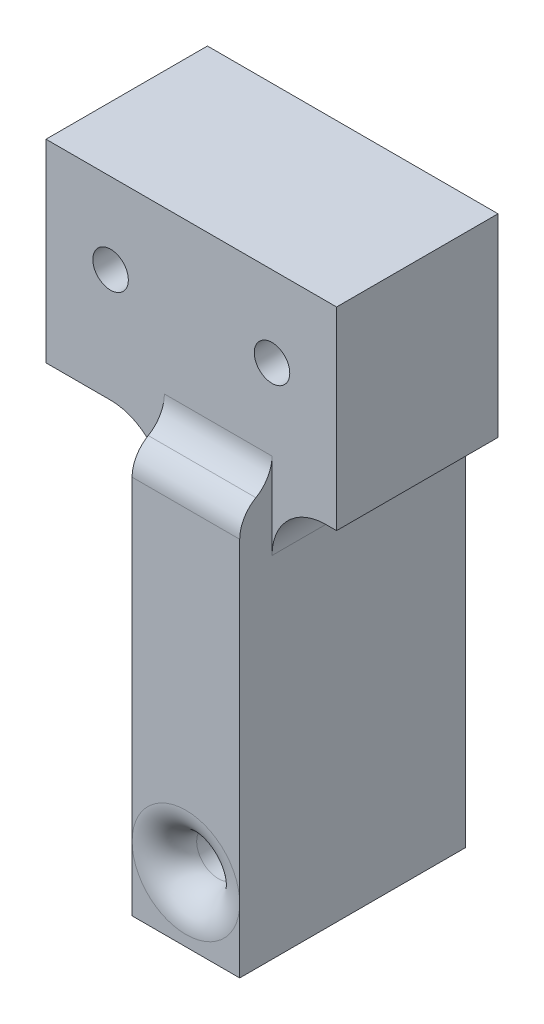
ISO-10303-21;
HEADER;
FILE_DESCRIPTION(('STEP AP214'),'2;1');
FILE_NAME('part.step','',(''),(''),'','','');
FILE_SCHEMA(('AUTOMOTIVE_DESIGN { 1 0 10303 214 1 1 1 1 }'));
ENDSEC;
DATA;
#1=APPLICATION_CONTEXT('core data for automotive mechanical design processes');
#2=APPLICATION_PROTOCOL_DEFINITION('international standard','automotive_design',2000,#1);
#3=PRODUCT_CONTEXT('',#1,'mechanical');
#4=PRODUCT('Part','Part','',(#3));
#5=PRODUCT_RELATED_PRODUCT_CATEGORY('part','',(#4));
#6=PRODUCT_DEFINITION_FORMATION('','',#4);
#7=PRODUCT_DEFINITION_CONTEXT('part definition',#1,'design');
#8=PRODUCT_DEFINITION('design','',#6,#7);
#9=PRODUCT_DEFINITION_SHAPE('','',#8);
#10=(LENGTH_UNIT() NAMED_UNIT(*) SI_UNIT(.MILLI.,.METRE.));
#11=(NAMED_UNIT(*) PLANE_ANGLE_UNIT() SI_UNIT($,.RADIAN.));
#12=(NAMED_UNIT(*) SI_UNIT($,.STERADIAN.) SOLID_ANGLE_UNIT());
#13=UNCERTAINTY_MEASURE_WITH_UNIT(LENGTH_MEASURE(1.E-05),#10,'distance_accuracy_value','');
#14=(GEOMETRIC_REPRESENTATION_CONTEXT(3) GLOBAL_UNCERTAINTY_ASSIGNED_CONTEXT((#13)) GLOBAL_UNIT_ASSIGNED_CONTEXT((#10,
#11,#12)) REPRESENTATION_CONTEXT('',''));
#15=CARTESIAN_POINT('',(0.,0.,0.));
#16=DIRECTION('',(0.,0.,1.));
#17=DIRECTION('',(1.,0.,0.));
#18=AXIS2_PLACEMENT_3D('',#15,#16,#17);
#19=CARTESIAN_POINT('',(-2.5,-48.,18.));
#20=DIRECTION('',(0.,0.,-1.));
#21=DIRECTION('',(-1.,0.,0.));
#22=AXIS2_PLACEMENT_3D('',#19,#20,#21);
#23=PLANE('',#22);
#24=DIRECTION('',(0.,1.,0.));
#25=VECTOR('',#24,1.);
#26=CARTESIAN_POINT('',(7.5,-48.,18.));
#27=LINE('',#26,#25);
#28=CARTESIAN_POINT('',(7.5,-42.,18.));
#29=VERTEX_POINT('',#28);
#30=CARTESIAN_POINT('',(7.5,-12.6961524227066,18.));
#31=VERTEX_POINT('',#30);
#32=EDGE_CURVE('E365',#29,#31,#27,.T.);
#33=ORIENTED_EDGE('',*,*,#32,.T.);
#34=DIRECTION('',(-1.,0.,0.));
#35=VECTOR('',#34,1.);
#36=CARTESIAN_POINT('',(-2.5,-12.6961524227066,18.));
#37=LINE('',#36,#35);
#38=CARTESIAN_POINT('',(-2.5,-12.6961524227066,18.));
#39=VERTEX_POINT('',#38);
#40=EDGE_CURVE('E296',#31,#39,#37,.T.);
#41=ORIENTED_EDGE('',*,*,#40,.T.);
#42=DIRECTION('',(0.,1.,0.));
#43=VECTOR('',#42,1.);
#44=CARTESIAN_POINT('',(-2.5,-48.,18.));
#45=LINE('',#44,#43);
#46=CARTESIAN_POINT('',(-2.5,-42.,18.));
#47=VERTEX_POINT('',#46);
#48=EDGE_CURVE('E368',#47,#39,#45,.T.);
#49=ORIENTED_EDGE('',*,*,#48,.F.);
#50=CARTESIAN_POINT('',(2.5,-42.,18.));
#51=DIRECTION('',(0.,0.,-1.));
#52=DIRECTION('',(-1.,0.,0.));
#53=AXIS2_PLACEMENT_3D('',#50,#51,#52);
#54=CIRCLE('',#53,5.);
#55=EDGE_CURVE('E254',#47,#29,#54,.T.);
#56=ORIENTED_EDGE('',*,*,#55,.T.);
#57=EDGE_LOOP('',(#33,#41,#49,#56));
#58=FACE_BOUND('',#57,.T.);
#59=ADVANCED_FACE('F41',(#58),#23,.F.);
#60=CARTESIAN_POINT('',(-2.5,-48.,-3.));
#61=DIRECTION('',(0.,0.,1.));
#62=DIRECTION('',(1.,0.,0.));
#63=AXIS2_PLACEMENT_3D('',#60,#61,#62);
#64=PLANE('',#63);
#65=DIRECTION('',(0.,1.,0.));
#66=VECTOR('',#65,1.);
#67=CARTESIAN_POINT('',(-2.5,-48.,-3.));
#68=LINE('',#67,#66);
#69=CARTESIAN_POINT('',(-2.5,-48.,-3.));
#70=VERTEX_POINT('',#69);
#71=CARTESIAN_POINT('',(-2.5,-42.,-3.));
#72=VERTEX_POINT('',#71);
#73=EDGE_CURVE('E172',#70,#72,#68,.T.);
#74=ORIENTED_EDGE('',*,*,#73,.T.);
#75=CARTESIAN_POINT('',(2.5,-42.,-3.));
#76=DIRECTION('',(0.,0.,1.));
#77=DIRECTION('',(1.,0.,0.));
#78=AXIS2_PLACEMENT_3D('',#75,#76,#77);
#79=CIRCLE('',#78,5.);
#80=CARTESIAN_POINT('',(7.5,-42.,-3.));
#81=VERTEX_POINT('',#80);
#82=EDGE_CURVE('E250',#72,#81,#79,.T.);
#83=ORIENTED_EDGE('',*,*,#82,.T.);
#84=DIRECTION('',(0.,1.,0.));
#85=VECTOR('',#84,1.);
#86=CARTESIAN_POINT('',(7.5,-48.,-3.));
#87=LINE('',#86,#85);
#88=CARTESIAN_POINT('',(7.5,-48.,-3.));
#89=VERTEX_POINT('',#88);
#90=EDGE_CURVE('E175',#89,#81,#87,.T.);
#91=ORIENTED_EDGE('',*,*,#90,.F.);
#92=DIRECTION('',(1.,0.,0.));
#93=VECTOR('',#92,1.);
#94=CARTESIAN_POINT('',(-2.5,-48.,-3.));
#95=LINE('',#94,#93);
#96=EDGE_CURVE('E167',#70,#89,#95,.T.);
#97=ORIENTED_EDGE('',*,*,#96,.F.);
#98=EDGE_LOOP('',(#74,#83,#91,#97));
#99=FACE_BOUND('',#98,.T.);
#100=ADVANCED_FACE('F169',(#99),#64,.F.);
#101=CARTESIAN_POINT('',(-13.5,-10.5,15.));
#102=DIRECTION('',(0.,1.,0.));
#103=DIRECTION('',(0.,0.,1.));
#104=AXIS2_PLACEMENT_3D('',#101,#102,#103);
#105=PLANE('',#104);
#106=DIRECTION('',(1.,0.,0.));
#107=VECTOR('',#106,1.);
#108=CARTESIAN_POINT('',(-13.5,-10.5,0.));
#109=LINE('',#108,#107);
#110=CARTESIAN_POINT('',(-13.5,-10.5,0.));
#111=VERTEX_POINT('',#110);
#112=CARTESIAN_POINT('',(-7.5,-10.5,0.));
#113=VERTEX_POINT('',#112);
#114=EDGE_CURVE('E228',#111,#113,#109,.T.);
#115=ORIENTED_EDGE('',*,*,#114,.T.);
#116=DIRECTION('',(0.,0.,-1.));
#117=VECTOR('',#116,1.);
#118=CARTESIAN_POINT('',(-7.5,-10.5,15.));
#119=LINE('',#118,#117);
#120=CARTESIAN_POINT('',(-7.5,-10.5,15.));
#121=VERTEX_POINT('',#120);
#122=EDGE_CURVE('E62',#113,#121,#119,.F.);
#123=ORIENTED_EDGE('',*,*,#122,.T.);
#124=DIRECTION('',(1.,0.,0.));
#125=VECTOR('',#124,1.);
#126=CARTESIAN_POINT('',(-13.5,-10.5,15.));
#127=LINE('',#126,#125);
#128=CARTESIAN_POINT('',(-13.5,-10.5,15.));
#129=VERTEX_POINT('',#128);
#130=EDGE_CURVE('E220',#129,#121,#127,.T.);
#131=ORIENTED_EDGE('',*,*,#130,.F.);
#132=DIRECTION('',(0.,0.,-1.));
#133=VECTOR('',#132,1.);
#134=CARTESIAN_POINT('',(-13.5,-10.5,15.));
#135=LINE('',#134,#133);
#136=EDGE_CURVE('E233',#129,#111,#135,.T.);
#137=ORIENTED_EDGE('',*,*,#136,.T.);
#138=EDGE_LOOP('',(#115,#123,#131,#137));
#139=FACE_BOUND('',#138,.T.);
#140=ADVANCED_FACE('F398',(#139),#105,.F.);
#141=CARTESIAN_POINT('',(12.5,-10.5,15.));
#142=VERTEX_POINT('',#141);
#143=CARTESIAN_POINT('',(13.5,-10.5,15.));
#144=VERTEX_POINT('',#143);
#145=EDGE_CURVE('E219',#142,#144,#127,.T.);
#146=ORIENTED_EDGE('',*,*,#145,.F.);
#147=DIRECTION('',(0.,0.,1.));
#148=VECTOR('',#147,1.);
#149=CARTESIAN_POINT('',(12.5,-10.5,0.));
#150=LINE('',#149,#148);
#151=CARTESIAN_POINT('',(12.5,-10.5,0.));
#152=VERTEX_POINT('',#151);
#153=EDGE_CURVE('E304',#142,#152,#150,.F.);
#154=ORIENTED_EDGE('',*,*,#153,.T.);
#155=CARTESIAN_POINT('',(13.5,-10.5,0.));
#156=VERTEX_POINT('',#155);
#157=EDGE_CURVE('E227',#152,#156,#109,.T.);
#158=ORIENTED_EDGE('',*,*,#157,.T.);
#159=DIRECTION('',(0.,0.,-1.));
#160=VECTOR('',#159,1.);
#161=CARTESIAN_POINT('',(13.5,-10.5,15.));
#162=LINE('',#161,#160);
#163=EDGE_CURVE('E222',#144,#156,#162,.T.);
#164=ORIENTED_EDGE('',*,*,#163,.F.);
#165=EDGE_LOOP('',(#146,#154,#158,#164));
#166=FACE_BOUND('',#165,.T.);
#167=ADVANCED_FACE('F424',(#166),#105,.F.);
#168=CARTESIAN_POINT('',(0.,0.,15.));
#169=DIRECTION('',(0.,0.,-1.));
#170=DIRECTION('',(-1.,0.,0.));
#171=AXIS2_PLACEMENT_3D('',#168,#169,#170);
#172=PLANE('',#171);
#173=DIRECTION('',(1.,0.,0.));
#174=VECTOR('',#173,1.);
#175=CARTESIAN_POINT('',(7.5,-7.5,15.));
#176=LINE('',#175,#174);
#177=CARTESIAN_POINT('',(-2.5,-7.5,15.));
#178=VERTEX_POINT('',#177);
#179=CARTESIAN_POINT('',(7.5,-7.5,15.));
#180=VERTEX_POINT('',#179);
#181=EDGE_CURVE('E268',#178,#180,#176,.T.);
#182=ORIENTED_EDGE('',*,*,#181,.T.);
#183=DIRECTION('',(0.,-1.,0.));
#184=VECTOR('',#183,1.);
#185=CARTESIAN_POINT('',(7.5,-48.,15.));
#186=LINE('',#185,#184);
#187=CARTESIAN_POINT('',(7.5,-15.5,15.));
#188=VERTEX_POINT('',#187);
#189=EDGE_CURVE('E271',#180,#188,#186,.T.);
#190=ORIENTED_EDGE('',*,*,#189,.T.);
#191=CARTESIAN_POINT('',(12.5,-15.5,15.));
#192=DIRECTION('',(0.,0.,-1.));
#193=DIRECTION('',(-1.,0.,0.));
#194=AXIS2_PLACEMENT_3D('',#191,#192,#193);
#195=CIRCLE('',#194,5.);
#196=EDGE_CURVE('E309',#188,#142,#195,.T.);
#197=ORIENTED_EDGE('',*,*,#196,.T.);
#198=ORIENTED_EDGE('',*,*,#145,.T.);
#199=DIRECTION('',(0.,1.,0.));
#200=VECTOR('',#199,1.);
#201=CARTESIAN_POINT('',(13.5,-7.5,15.));
#202=LINE('',#201,#200);
#203=CARTESIAN_POINT('',(13.5,7.5,15.));
#204=VERTEX_POINT('',#203);
#205=EDGE_CURVE('E211',#144,#204,#202,.T.);
#206=ORIENTED_EDGE('',*,*,#205,.T.);
#207=DIRECTION('',(-1.,0.,0.));
#208=VECTOR('',#207,1.);
#209=CARTESIAN_POINT('',(-13.5,7.5,15.));
#210=LINE('',#209,#208);
#211=CARTESIAN_POINT('',(-13.5,7.5,15.));
#212=VERTEX_POINT('',#211);
#213=EDGE_CURVE('E214',#204,#212,#210,.T.);
#214=ORIENTED_EDGE('',*,*,#213,.T.);
#215=DIRECTION('',(0.,-1.,0.));
#216=VECTOR('',#215,1.);
#217=CARTESIAN_POINT('',(-13.5,-7.5,15.));
#218=LINE('',#217,#216);
#219=EDGE_CURVE('E217',#212,#129,#218,.T.);
#220=ORIENTED_EDGE('',*,*,#219,.T.);
#221=ORIENTED_EDGE('',*,*,#130,.T.);
#222=CARTESIAN_POINT('',(-7.5,-15.5,15.));
#223=DIRECTION('',(0.,0.,-1.));
#224=DIRECTION('',(-1.,0.,0.));
#225=AXIS2_PLACEMENT_3D('',#222,#223,#224);
#226=CIRCLE('',#225,5.);
#227=CARTESIAN_POINT('',(-2.5,-15.5,15.));
#228=VERTEX_POINT('',#227);
#229=EDGE_CURVE('E11',#121,#228,#226,.T.);
#230=ORIENTED_EDGE('',*,*,#229,.T.);
#231=DIRECTION('',(0.,1.,0.));
#232=VECTOR('',#231,1.);
#233=CARTESIAN_POINT('',(-2.5,-48.,15.));
#234=LINE('',#233,#232);
#235=EDGE_CURVE('E265',#228,#178,#234,.T.);
#236=ORIENTED_EDGE('',*,*,#235,.T.);
#237=EDGE_LOOP('',(#182,#190,#197,#198,#206,#214,#220,#221,#230,#236));
#238=FACE_BOUND('',#237,.T.);
#239=CARTESIAN_POINT('',(7.5,0.,15.));
#240=DIRECTION('',(0.,0.,1.));
#241=DIRECTION('',(1.,0.,0.));
#242=AXIS2_PLACEMENT_3D('',#239,#240,#241);
#243=CIRCLE('',#242,1.65);
#244=CARTESIAN_POINT('',(9.15,0.,15.));
#245=VERTEX_POINT('',#244);
#246=EDGE_CURVE('E205',#245,#245,#243,.T.);
#247=ORIENTED_EDGE('',*,*,#246,.F.);
#248=EDGE_LOOP('',(#247));
#249=FACE_BOUND('',#248,.T.);
#250=CARTESIAN_POINT('',(-7.5,0.,15.));
#251=DIRECTION('',(0.,0.,1.));
#252=DIRECTION('',(1.,0.,0.));
#253=AXIS2_PLACEMENT_3D('',#250,#251,#252);
#254=CIRCLE('',#253,1.65);
#255=CARTESIAN_POINT('',(-5.85,0.,15.));
#256=VERTEX_POINT('',#255);
#257=EDGE_CURVE('E197',#256,#256,#254,.T.);
#258=ORIENTED_EDGE('',*,*,#257,.F.);
#259=EDGE_LOOP('',(#258));
#260=FACE_BOUND('',#259,.T.);
#261=ADVANCED_FACE('F421',(#238,#249,#260),#172,.F.);
#262=CARTESIAN_POINT('',(0.,0.,0.));
#263=DIRECTION('',(0.,0.,-1.));
#264=DIRECTION('',(-1.,0.,0.));
#265=AXIS2_PLACEMENT_3D('',#262,#263,#264);
#266=PLANE('',#265);
#267=CARTESIAN_POINT('',(7.5,0.,0.));
#268=DIRECTION('',(0.,0.,1.));
#269=DIRECTION('',(1.,0.,0.));
#270=AXIS2_PLACEMENT_3D('',#267,#268,#269);
#271=CIRCLE('',#270,1.65);
#272=CARTESIAN_POINT('',(9.15,0.,0.));
#273=VERTEX_POINT('',#272);
#274=EDGE_CURVE('E203',#273,#273,#271,.T.);
#275=ORIENTED_EDGE('',*,*,#274,.T.);
#276=EDGE_LOOP('',(#275));
#277=FACE_BOUND('',#276,.T.);
#278=ORIENTED_EDGE('',*,*,#157,.F.);
#279=CARTESIAN_POINT('',(12.5,-15.5,0.));
#280=DIRECTION('',(0.,0.,-1.));
#281=DIRECTION('',(-1.,0.,0.));
#282=AXIS2_PLACEMENT_3D('',#279,#280,#281);
#283=CIRCLE('',#282,5.);
#284=CARTESIAN_POINT('',(7.5,-15.5,0.));
#285=VERTEX_POINT('',#284);
#286=EDGE_CURVE('E311',#152,#285,#283,.F.);
#287=ORIENTED_EDGE('',*,*,#286,.T.);
#288=DIRECTION('',(0.,1.,0.));
#289=VECTOR('',#288,1.);
#290=CARTESIAN_POINT('',(7.5,0.,0.));
#291=LINE('',#290,#289);
#292=CARTESIAN_POINT('',(7.5,-7.5,0.));
#293=VERTEX_POINT('',#292);
#294=EDGE_CURVE('E262',#285,#293,#291,.T.);
#295=ORIENTED_EDGE('',*,*,#294,.T.);
#296=DIRECTION('',(1.,0.,0.));
#297=VECTOR('',#296,1.);
#298=CARTESIAN_POINT('',(0.,-7.5,0.));
#299=LINE('',#298,#297);
#300=CARTESIAN_POINT('',(-2.5,-7.5,0.));
#301=VERTEX_POINT('',#300);
#302=EDGE_CURVE('E259',#293,#301,#299,.F.);
#303=ORIENTED_EDGE('',*,*,#302,.T.);
#304=DIRECTION('',(0.,-1.,0.));
#305=VECTOR('',#304,1.);
#306=CARTESIAN_POINT('',(-2.5,0.,0.));
#307=LINE('',#306,#305);
#308=CARTESIAN_POINT('',(-2.5,-15.5,0.));
#309=VERTEX_POINT('',#308);
#310=EDGE_CURVE('E257',#301,#309,#307,.T.);
#311=ORIENTED_EDGE('',*,*,#310,.T.);
#312=CARTESIAN_POINT('',(-7.5,-15.5,0.));
#313=DIRECTION('',(0.,0.,-1.));
#314=DIRECTION('',(-1.,0.,0.));
#315=AXIS2_PLACEMENT_3D('',#312,#313,#314);
#316=CIRCLE('',#315,5.);
#317=EDGE_CURVE('E49',#309,#113,#316,.F.);
#318=ORIENTED_EDGE('',*,*,#317,.T.);
#319=ORIENTED_EDGE('',*,*,#114,.F.);
#320=DIRECTION('',(0.,-1.,0.));
#321=VECTOR('',#320,1.);
#322=CARTESIAN_POINT('',(-13.5,-7.5,0.));
#323=LINE('',#322,#321);
#324=CARTESIAN_POINT('',(-13.5,7.5,0.));
#325=VERTEX_POINT('',#324);
#326=EDGE_CURVE('E225',#325,#111,#323,.T.);
#327=ORIENTED_EDGE('',*,*,#326,.F.);
#328=DIRECTION('',(-1.,0.,0.));
#329=VECTOR('',#328,1.);
#330=CARTESIAN_POINT('',(-13.5,7.5,0.));
#331=LINE('',#330,#329);
#332=CARTESIAN_POINT('',(13.5,7.5,0.));
#333=VERTEX_POINT('',#332);
#334=EDGE_CURVE('E208',#333,#325,#331,.T.);
#335=ORIENTED_EDGE('',*,*,#334,.F.);
#336=DIRECTION('',(0.,1.,0.));
#337=VECTOR('',#336,1.);
#338=CARTESIAN_POINT('',(13.5,-10.5,0.));
#339=LINE('',#338,#337);
#340=EDGE_CURVE('E215',#156,#333,#339,.T.);
#341=ORIENTED_EDGE('',*,*,#340,.F.);
#342=EDGE_LOOP('',(#278,#287,#295,#303,#311,#318,#319,#327,#335,#341));
#343=FACE_BOUND('',#342,.T.);
#344=CARTESIAN_POINT('',(-7.5,0.,0.));
#345=DIRECTION('',(0.,0.,1.));
#346=DIRECTION('',(1.,0.,0.));
#347=AXIS2_PLACEMENT_3D('',#344,#345,#346);
#348=CIRCLE('',#347,1.65);
#349=CARTESIAN_POINT('',(-5.85,0.,0.));
#350=VERTEX_POINT('',#349);
#351=EDGE_CURVE('E194',#350,#350,#348,.T.);
#352=ORIENTED_EDGE('',*,*,#351,.T.);
#353=EDGE_LOOP('',(#352));
#354=FACE_BOUND('',#353,.T.);
#355=ADVANCED_FACE('F316',(#277,#343,#354),#266,.T.);
#356=CARTESIAN_POINT('',(-13.5,7.5,15.));
#357=DIRECTION('',(0.,-1.,0.));
#358=DIRECTION('',(0.,0.,-1.));
#359=AXIS2_PLACEMENT_3D('',#356,#357,#358);
#360=PLANE('',#359);
#361=ORIENTED_EDGE('',*,*,#334,.T.);
#362=DIRECTION('',(0.,0.,-1.));
#363=VECTOR('',#362,1.);
#364=CARTESIAN_POINT('',(-13.5,7.5,15.));
#365=LINE('',#364,#363);
#366=EDGE_CURVE('E236',#212,#325,#365,.T.);
#367=ORIENTED_EDGE('',*,*,#366,.F.);
#368=ORIENTED_EDGE('',*,*,#213,.F.);
#369=DIRECTION('',(0.,0.,-1.));
#370=VECTOR('',#369,1.);
#371=CARTESIAN_POINT('',(13.5,7.5,15.));
#372=LINE('',#371,#370);
#373=EDGE_CURVE('E239',#204,#333,#372,.T.);
#374=ORIENTED_EDGE('',*,*,#373,.T.);
#375=EDGE_LOOP('',(#361,#367,#368,#374));
#376=FACE_BOUND('',#375,.T.);
#377=ADVANCED_FACE('F428',(#376),#360,.F.);
#378=CARTESIAN_POINT('',(-13.5,-7.5,15.));
#379=DIRECTION('',(1.,0.,0.));
#380=DIRECTION('',(0.,1.,0.));
#381=AXIS2_PLACEMENT_3D('',#378,#379,#380);
#382=PLANE('',#381);
#383=ORIENTED_EDGE('',*,*,#326,.T.);
#384=ORIENTED_EDGE('',*,*,#136,.F.);
#385=ORIENTED_EDGE('',*,*,#219,.F.);
#386=ORIENTED_EDGE('',*,*,#366,.T.);
#387=EDGE_LOOP('',(#383,#384,#385,#386));
#388=FACE_BOUND('',#387,.T.);
#389=ADVANCED_FACE('F432',(#388),#382,.F.);
#390=CARTESIAN_POINT('',(13.5,-10.5,15.));
#391=DIRECTION('',(-1.,0.,0.));
#392=DIRECTION('',(0.,-1.,0.));
#393=AXIS2_PLACEMENT_3D('',#390,#391,#392);
#394=PLANE('',#393);
#395=ORIENTED_EDGE('',*,*,#340,.T.);
#396=ORIENTED_EDGE('',*,*,#373,.F.);
#397=ORIENTED_EDGE('',*,*,#205,.F.);
#398=ORIENTED_EDGE('',*,*,#163,.T.);
#399=EDGE_LOOP('',(#395,#396,#397,#398));
#400=FACE_BOUND('',#399,.T.);
#401=ADVANCED_FACE('F419',(#400),#394,.F.);
#402=CARTESIAN_POINT('',(7.5,0.,15.));
#403=DIRECTION('',(0.,0.,-1.));
#404=DIRECTION('',(-1.,0.,0.));
#405=AXIS2_PLACEMENT_3D('',#402,#403,#404);
#406=CYLINDRICAL_SURFACE('',#405,1.65);
#407=ORIENTED_EDGE('',*,*,#246,.T.);
#408=EDGE_LOOP('',(#407));
#409=FACE_BOUND('',#408,.T.);
#410=ORIENTED_EDGE('',*,*,#274,.F.);
#411=EDGE_LOOP('',(#410));
#412=FACE_BOUND('',#411,.T.);
#413=ADVANCED_FACE('F415',(#409,#412),#406,.F.);
#414=CARTESIAN_POINT('',(-7.5,0.,15.));
#415=DIRECTION('',(0.,0.,-1.));
#416=DIRECTION('',(-1.,0.,0.));
#417=AXIS2_PLACEMENT_3D('',#414,#415,#416);
#418=CYLINDRICAL_SURFACE('',#417,1.65);
#419=ORIENTED_EDGE('',*,*,#257,.T.);
#420=EDGE_LOOP('',(#419));
#421=FACE_BOUND('',#420,.T.);
#422=ORIENTED_EDGE('',*,*,#351,.F.);
#423=EDGE_LOOP('',(#422));
#424=FACE_BOUND('',#423,.T.);
#425=ADVANCED_FACE('F412',(#421,#424),#418,.F.);
#426=CARTESIAN_POINT('',(-2.5,-48.,18.));
#427=DIRECTION('',(1.,0.,0.));
#428=DIRECTION('',(0.,0.,-1.));
#429=AXIS2_PLACEMENT_3D('',#426,#427,#428);
#430=PLANE('',#429);
#431=DIRECTION('',(0.,0.,-1.));
#432=VECTOR('',#431,1.);
#433=CARTESIAN_POINT('',(-2.5,-15.5,0.));
#434=LINE('',#433,#432);
#435=EDGE_CURVE('E306',#228,#309,#434,.T.);
#436=ORIENTED_EDGE('',*,*,#435,.T.);
#437=ORIENTED_EDGE('',*,*,#310,.F.);
#438=CARTESIAN_POINT('',(-2.5,-7.5,-3.));
#439=DIRECTION('',(1.,0.,0.));
#440=DIRECTION('',(0.,0.,-1.));
#441=AXIS2_PLACEMENT_3D('',#438,#439,#440);
#442=CIRCLE('',#441,3.);
#443=CARTESIAN_POINT('',(-2.5,-10.0980762113533,-1.5));
#444=VERTEX_POINT('',#443);
#445=EDGE_CURVE('E275',#301,#444,#442,.T.);
#446=ORIENTED_EDGE('',*,*,#445,.T.);
#447=CARTESIAN_POINT('',(-2.5,-12.6961524227066,0.));
#448=DIRECTION('',(1.,0.,0.));
#449=DIRECTION('',(0.,0.,-1.));
#450=AXIS2_PLACEMENT_3D('',#447,#448,#449);
#451=CIRCLE('',#450,3.);
#452=CARTESIAN_POINT('',(-2.5,-12.6961524227066,-3.));
#453=VERTEX_POINT('',#452);
#454=EDGE_CURVE('E294',#444,#453,#451,.F.);
#455=ORIENTED_EDGE('',*,*,#454,.T.);
#456=EDGE_CURVE('E193',#72,#453,#68,.T.);
#457=ORIENTED_EDGE('',*,*,#456,.F.);
#458=ORIENTED_EDGE('',*,*,#73,.F.);
#459=DIRECTION('',(0.,0.,-1.));
#460=VECTOR('',#459,1.);
#461=CARTESIAN_POINT('',(-2.5,-48.,18.));
#462=LINE('',#461,#460);
#463=CARTESIAN_POINT('',(-2.5,-48.,18.));
#464=VERTEX_POINT('',#463);
#465=EDGE_CURVE('E179',#464,#70,#462,.T.);
#466=ORIENTED_EDGE('',*,*,#465,.F.);
#467=EDGE_CURVE('E372',#464,#47,#45,.T.);
#468=ORIENTED_EDGE('',*,*,#467,.T.);
#469=ORIENTED_EDGE('',*,*,#48,.T.);
#470=CARTESIAN_POINT('',(-2.5,-12.6961524227066,15.));
#471=DIRECTION('',(1.,0.,0.));
#472=DIRECTION('',(0.,0.,-1.));
#473=AXIS2_PLACEMENT_3D('',#470,#471,#472);
#474=CIRCLE('',#473,3.);
#475=CARTESIAN_POINT('',(-2.5,-10.0980762113533,16.5));
#476=VERTEX_POINT('',#475);
#477=EDGE_CURVE('E292',#39,#476,#474,.F.);
#478=ORIENTED_EDGE('',*,*,#477,.T.);
#479=CARTESIAN_POINT('',(-2.5,-7.5,18.));
#480=DIRECTION('',(1.,0.,0.));
#481=DIRECTION('',(0.,0.,-1.));
#482=AXIS2_PLACEMENT_3D('',#479,#480,#481);
#483=CIRCLE('',#482,3.);
#484=EDGE_CURVE('E281',#476,#178,#483,.T.);
#485=ORIENTED_EDGE('',*,*,#484,.T.);
#486=ORIENTED_EDGE('',*,*,#235,.F.);
#487=EDGE_LOOP('',(#436,#437,#446,#455,#457,#458,#466,#468,#469,#478,#485,#486));
#488=FACE_BOUND('',#487,.T.);
#489=ADVANCED_FACE('F191',(#488),#430,.F.);
#490=ORIENTED_EDGE('',*,*,#456,.T.);
#491=DIRECTION('',(1.,0.,0.));
#492=VECTOR('',#491,1.);
#493=CARTESIAN_POINT('',(-2.5,-12.6961524227066,-3.));
#494=LINE('',#493,#492);
#495=CARTESIAN_POINT('',(7.5,-12.6961524227066,-3.));
#496=VERTEX_POINT('',#495);
#497=EDGE_CURVE('E283',#453,#496,#494,.T.);
#498=ORIENTED_EDGE('',*,*,#497,.T.);
#499=EDGE_CURVE('E340',#81,#496,#87,.T.);
#500=ORIENTED_EDGE('',*,*,#499,.F.);
#501=CARTESIAN_POINT('',(2.5,-42.,-3.));
#502=DIRECTION('',(0.,0.,1.));
#503=DIRECTION('',(1.,0.,0.));
#504=AXIS2_PLACEMENT_3D('',#501,#502,#503);
#505=CIRCLE('',#504,5.);
#506=EDGE_CURVE('E248',#81,#72,#505,.T.);
#507=ORIENTED_EDGE('',*,*,#506,.T.);
#508=EDGE_LOOP('',(#490,#498,#500,#507));
#509=FACE_BOUND('',#508,.T.);
#510=ADVANCED_FACE('F338',(#509),#64,.F.);
#511=CARTESIAN_POINT('',(7.5,-48.,18.));
#512=DIRECTION('',(-1.,0.,0.));
#513=DIRECTION('',(0.,0.,1.));
#514=AXIS2_PLACEMENT_3D('',#511,#512,#513);
#515=PLANE('',#514);
#516=DIRECTION('',(0.,0.,1.));
#517=VECTOR('',#516,1.);
#518=CARTESIAN_POINT('',(7.5,-15.5,15.));
#519=LINE('',#518,#517);
#520=EDGE_CURVE('E301',#285,#188,#519,.T.);
#521=ORIENTED_EDGE('',*,*,#520,.T.);
#522=ORIENTED_EDGE('',*,*,#189,.F.);
#523=CARTESIAN_POINT('',(7.5,-7.5,18.));
#524=DIRECTION('',(-1.,0.,0.));
#525=DIRECTION('',(0.,0.,1.));
#526=AXIS2_PLACEMENT_3D('',#523,#524,#525);
#527=CIRCLE('',#526,3.);
#528=CARTESIAN_POINT('',(7.5,-10.0980762113533,16.5));
#529=VERTEX_POINT('',#528);
#530=EDGE_CURVE('E278',#180,#529,#527,.T.);
#531=ORIENTED_EDGE('',*,*,#530,.T.);
#532=CARTESIAN_POINT('',(7.5,-12.6961524227066,15.));
#533=DIRECTION('',(-1.,0.,0.));
#534=DIRECTION('',(0.,0.,1.));
#535=AXIS2_PLACEMENT_3D('',#532,#533,#534);
#536=CIRCLE('',#535,3.);
#537=EDGE_CURVE('E286',#529,#31,#536,.F.);
#538=ORIENTED_EDGE('',*,*,#537,.T.);
#539=ORIENTED_EDGE('',*,*,#32,.F.);
#540=CARTESIAN_POINT('',(7.5,-48.,18.));
#541=VERTEX_POINT('',#540);
#542=EDGE_CURVE('E370',#541,#29,#27,.T.);
#543=ORIENTED_EDGE('',*,*,#542,.F.);
#544=DIRECTION('',(0.,0.,1.));
#545=VECTOR('',#544,1.);
#546=CARTESIAN_POINT('',(7.5,-48.,18.));
#547=LINE('',#546,#545);
#548=EDGE_CURVE('E178',#89,#541,#547,.T.);
#549=ORIENTED_EDGE('',*,*,#548,.F.);
#550=ORIENTED_EDGE('',*,*,#90,.T.);
#551=ORIENTED_EDGE('',*,*,#499,.T.);
#552=CARTESIAN_POINT('',(7.5,-12.6961524227066,0.));
#553=DIRECTION('',(-1.,0.,0.));
#554=DIRECTION('',(0.,0.,1.));
#555=AXIS2_PLACEMENT_3D('',#552,#553,#554);
#556=CIRCLE('',#555,3.);
#557=CARTESIAN_POINT('',(7.5,-10.0980762113533,-1.5));
#558=VERTEX_POINT('',#557);
#559=EDGE_CURVE('E288',#496,#558,#556,.F.);
#560=ORIENTED_EDGE('',*,*,#559,.T.);
#561=CARTESIAN_POINT('',(7.5,-7.5,-3.));
#562=DIRECTION('',(-1.,0.,0.));
#563=DIRECTION('',(0.,0.,1.));
#564=AXIS2_PLACEMENT_3D('',#561,#562,#563);
#565=CIRCLE('',#564,3.);
#566=EDGE_CURVE('E273',#558,#293,#565,.T.);
#567=ORIENTED_EDGE('',*,*,#566,.T.);
#568=ORIENTED_EDGE('',*,*,#294,.F.);
#569=EDGE_LOOP('',(#521,#522,#531,#538,#539,#543,#549,#550,#551,#560,#567,#568));
#570=FACE_BOUND('',#569,.T.);
#571=ADVANCED_FACE('F326',(#570),#515,.F.);
#572=ORIENTED_EDGE('',*,*,#542,.T.);
#573=CARTESIAN_POINT('',(2.5,-42.,18.));
#574=DIRECTION('',(0.,0.,-1.));
#575=DIRECTION('',(-1.,0.,0.));
#576=AXIS2_PLACEMENT_3D('',#573,#574,#575);
#577=CIRCLE('',#576,5.);
#578=EDGE_CURVE('E252',#29,#47,#577,.T.);
#579=ORIENTED_EDGE('',*,*,#578,.T.);
#580=ORIENTED_EDGE('',*,*,#467,.F.);
#581=DIRECTION('',(-1.,0.,0.));
#582=VECTOR('',#581,1.);
#583=CARTESIAN_POINT('',(-2.5,-48.,18.));
#584=LINE('',#583,#582);
#585=EDGE_CURVE('E184',#541,#464,#584,.T.);
#586=ORIENTED_EDGE('',*,*,#585,.F.);
#587=EDGE_LOOP('',(#572,#579,#580,#586));
#588=FACE_BOUND('',#587,.T.);
#589=ADVANCED_FACE('F373',(#588),#23,.F.);
#590=CARTESIAN_POINT('',(0.,-48.,0.));
#591=DIRECTION('',(0.,-1.,0.));
#592=DIRECTION('',(0.,0.,-1.));
#593=AXIS2_PLACEMENT_3D('',#590,#591,#592);
#594=PLANE('',#593);
#595=ORIENTED_EDGE('',*,*,#465,.T.);
#596=ORIENTED_EDGE('',*,*,#96,.T.);
#597=ORIENTED_EDGE('',*,*,#548,.T.);
#598=ORIENTED_EDGE('',*,*,#585,.T.);
#599=EDGE_LOOP('',(#595,#596,#597,#598));
#600=FACE_BOUND('',#599,.T.);
#601=ADVANCED_FACE('F182',(#600),#594,.T.);
#602=CARTESIAN_POINT('',(2.5,-42.,18.));
#603=DIRECTION('',(0.,0.,-1.));
#604=DIRECTION('',(-1.,0.,0.));
#605=AXIS2_PLACEMENT_3D('',#602,#603,#604);
#606=CYLINDRICAL_SURFACE('',#605,2.);
#607=CARTESIAN_POINT('',(2.5,-42.,0.));
#608=DIRECTION('',(0.,0.,1.));
#609=DIRECTION('',(1.,0.,0.));
#610=AXIS2_PLACEMENT_3D('',#607,#608,#609);
#611=CIRCLE('',#610,2.);
#612=CARTESIAN_POINT('',(4.5,-42.,0.));
#613=VERTEX_POINT('',#612);
#614=EDGE_CURVE('E245',#613,#613,#611,.F.);
#615=ORIENTED_EDGE('',*,*,#614,.T.);
#616=EDGE_LOOP('',(#615));
#617=FACE_BOUND('',#616,.T.);
#618=CARTESIAN_POINT('',(2.5,-42.,15.));
#619=DIRECTION('',(0.,0.,-1.));
#620=DIRECTION('',(-1.,0.,0.));
#621=AXIS2_PLACEMENT_3D('',#618,#619,#620);
#622=CIRCLE('',#621,2.);
#623=CARTESIAN_POINT('',(0.499999999999999,-42.,15.));
#624=VERTEX_POINT('',#623);
#625=EDGE_CURVE('E242',#624,#624,#622,.F.);
#626=ORIENTED_EDGE('',*,*,#625,.T.);
#627=EDGE_LOOP('',(#626));
#628=FACE_BOUND('',#627,.T.);
#629=ADVANCED_FACE('F346',(#617,#628),#606,.F.);
#630=CARTESIAN_POINT('',(2.5,-42.,0.));
#631=DIRECTION('',(0.,0.,1.));
#632=DIRECTION('',(1.,0.,0.));
#633=AXIS2_PLACEMENT_3D('',#630,#631,#632);
#634=TOROIDAL_SURFACE('',#633,5.,3.);
#635=ORIENTED_EDGE('',*,*,#506,.F.);
#636=ORIENTED_EDGE('',*,*,#82,.F.);
#637=EDGE_LOOP('',(#635,#636));
#638=FACE_BOUND('',#637,.T.);
#639=ORIENTED_EDGE('',*,*,#614,.F.);
#640=EDGE_LOOP('',(#639));
#641=FACE_BOUND('',#640,.T.);
#642=ADVANCED_FACE('F342',(#638,#641),#634,.T.);
#643=CARTESIAN_POINT('',(2.5,-42.,15.));
#644=DIRECTION('',(0.,0.,-1.));
#645=DIRECTION('',(-1.,0.,0.));
#646=AXIS2_PLACEMENT_3D('',#643,#644,#645);
#647=TOROIDAL_SURFACE('',#646,5.,3.);
#648=ORIENTED_EDGE('',*,*,#625,.F.);
#649=EDGE_LOOP('',(#648));
#650=FACE_BOUND('',#649,.T.);
#651=ORIENTED_EDGE('',*,*,#578,.F.);
#652=ORIENTED_EDGE('',*,*,#55,.F.);
#653=EDGE_LOOP('',(#651,#652));
#654=FACE_BOUND('',#653,.T.);
#655=ADVANCED_FACE('F345',(#650,#654),#647,.T.);
#656=CARTESIAN_POINT('',(0.,-7.5,-3.));
#657=DIRECTION('',(1.,0.,0.));
#658=DIRECTION('',(0.,0.,-1.));
#659=AXIS2_PLACEMENT_3D('',#656,#657,#658);
#660=CYLINDRICAL_SURFACE('',#659,3.);
#661=ORIENTED_EDGE('',*,*,#566,.F.);
#662=DIRECTION('',(1.,0.,0.));
#663=VECTOR('',#662,1.);
#664=CARTESIAN_POINT('',(0.,-10.0980762113533,-1.5));
#665=LINE('',#664,#663);
#666=EDGE_CURVE('E290',#558,#444,#665,.F.);
#667=ORIENTED_EDGE('',*,*,#666,.T.);
#668=ORIENTED_EDGE('',*,*,#445,.F.);
#669=ORIENTED_EDGE('',*,*,#302,.F.);
#670=EDGE_LOOP('',(#661,#667,#668,#669));
#671=FACE_BOUND('',#670,.T.);
#672=ADVANCED_FACE('F331',(#671),#660,.F.);
#673=CARTESIAN_POINT('',(0.,-7.5,18.));
#674=DIRECTION('',(-1.,0.,0.));
#675=DIRECTION('',(0.,0.,1.));
#676=AXIS2_PLACEMENT_3D('',#673,#674,#675);
#677=CYLINDRICAL_SURFACE('',#676,3.);
#678=ORIENTED_EDGE('',*,*,#484,.F.);
#679=DIRECTION('',(-1.,0.,0.));
#680=VECTOR('',#679,1.);
#681=CARTESIAN_POINT('',(0.,-10.0980762113533,16.5));
#682=LINE('',#681,#680);
#683=EDGE_CURVE('E299',#476,#529,#682,.F.);
#684=ORIENTED_EDGE('',*,*,#683,.T.);
#685=ORIENTED_EDGE('',*,*,#530,.F.);
#686=ORIENTED_EDGE('',*,*,#181,.F.);
#687=EDGE_LOOP('',(#678,#684,#685,#686));
#688=FACE_BOUND('',#687,.T.);
#689=ADVANCED_FACE('F382',(#688),#677,.F.);
#690=CARTESIAN_POINT('',(0.,-12.6961524227066,0.));
#691=DIRECTION('',(1.,0.,0.));
#692=DIRECTION('',(0.,0.,-1.));
#693=AXIS2_PLACEMENT_3D('',#690,#691,#692);
#694=CYLINDRICAL_SURFACE('',#693,3.);
#695=ORIENTED_EDGE('',*,*,#454,.F.);
#696=ORIENTED_EDGE('',*,*,#666,.F.);
#697=ORIENTED_EDGE('',*,*,#559,.F.);
#698=ORIENTED_EDGE('',*,*,#497,.F.);
#699=EDGE_LOOP('',(#695,#696,#697,#698));
#700=FACE_BOUND('',#699,.T.);
#701=ADVANCED_FACE('F335',(#700),#694,.T.);
#702=CARTESIAN_POINT('',(0.,-12.6961524227066,15.));
#703=DIRECTION('',(-1.,0.,0.));
#704=DIRECTION('',(0.,0.,1.));
#705=AXIS2_PLACEMENT_3D('',#702,#703,#704);
#706=CYLINDRICAL_SURFACE('',#705,3.);
#707=ORIENTED_EDGE('',*,*,#537,.F.);
#708=ORIENTED_EDGE('',*,*,#683,.F.);
#709=ORIENTED_EDGE('',*,*,#477,.F.);
#710=ORIENTED_EDGE('',*,*,#40,.F.);
#711=EDGE_LOOP('',(#707,#708,#709,#710));
#712=FACE_BOUND('',#711,.T.);
#713=ADVANCED_FACE('F383',(#712),#706,.T.);
#714=CARTESIAN_POINT('',(12.5,-15.5,18.));
#715=DIRECTION('',(0.,0.,-1.));
#716=DIRECTION('',(-1.,0.,0.));
#717=AXIS2_PLACEMENT_3D('',#714,#715,#716);
#718=CYLINDRICAL_SURFACE('',#717,5.);
#719=ORIENTED_EDGE('',*,*,#286,.F.);
#720=ORIENTED_EDGE('',*,*,#153,.F.);
#721=ORIENTED_EDGE('',*,*,#196,.F.);
#722=ORIENTED_EDGE('',*,*,#520,.F.);
#723=EDGE_LOOP('',(#719,#720,#721,#722));
#724=FACE_BOUND('',#723,.T.);
#725=ADVANCED_FACE('F323',(#724),#718,.F.);
#726=CARTESIAN_POINT('',(-7.5,-15.5,18.));
#727=DIRECTION('',(0.,0.,1.));
#728=DIRECTION('',(1.,0.,0.));
#729=AXIS2_PLACEMENT_3D('',#726,#727,#728);
#730=CYLINDRICAL_SURFACE('',#729,5.);
#731=ORIENTED_EDGE('',*,*,#229,.F.);
#732=ORIENTED_EDGE('',*,*,#122,.F.);
#733=ORIENTED_EDGE('',*,*,#317,.F.);
#734=ORIENTED_EDGE('',*,*,#435,.F.);
#735=EDGE_LOOP('',(#731,#732,#733,#734));
#736=FACE_BOUND('',#735,.T.);
#737=ADVANCED_FACE('F43',(#736),#730,.F.);
#738=CLOSED_SHELL('',(#59,#100,#140,#167,#261,#355,#377,#389,#401,#413,#425,#489,#510,#571,#589,
#601,#629,#642,#655,#672,#689,#701,#713,#725,#737));
#739=MANIFOLD_SOLID_BREP('B2',#738);
#740=ADVANCED_BREP_SHAPE_REPRESENTATION('',(#18,#739),#14);
#741=SHAPE_DEFINITION_REPRESENTATION(#9,#740);
ENDSEC;
END-ISO-10303-21;
